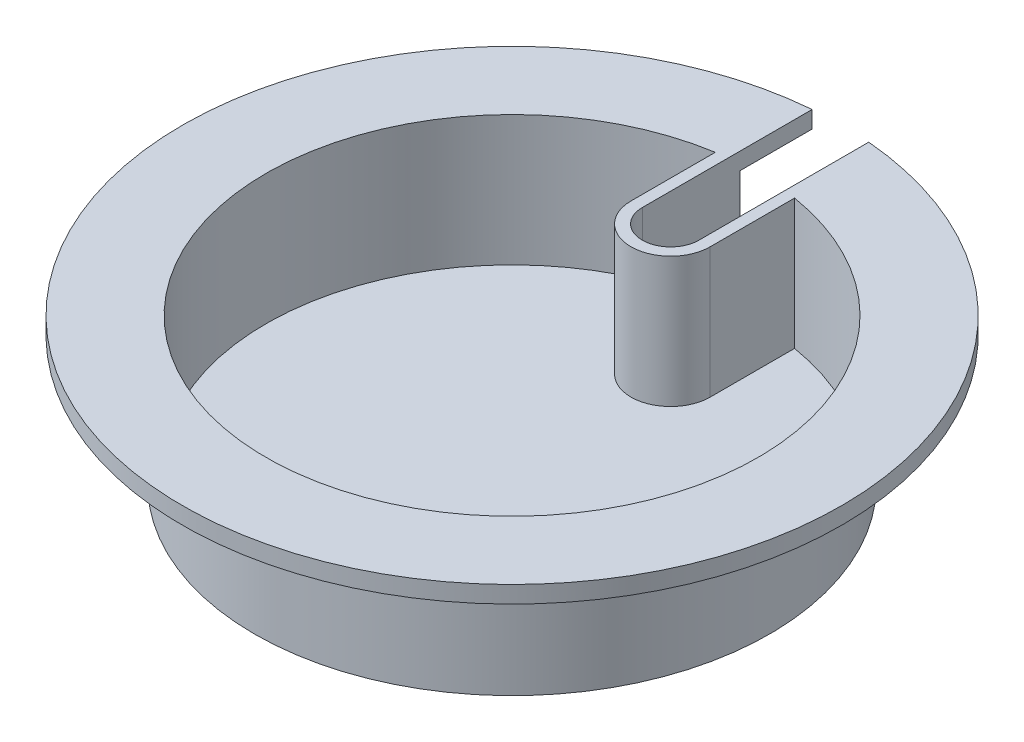
ISO-10303-21;
HEADER;
FILE_DESCRIPTION(('STEP AP214'),'2;1');
FILE_NAME('part.step','',(''),(''),'','','');
FILE_SCHEMA(('AUTOMOTIVE_DESIGN { 1 0 10303 214 1 1 1 1 }'));
ENDSEC;
DATA;
#1=APPLICATION_CONTEXT('core data for automotive mechanical design processes');
#2=APPLICATION_PROTOCOL_DEFINITION('international standard','automotive_design',2000,#1);
#3=PRODUCT_CONTEXT('',#1,'mechanical');
#4=PRODUCT('Part','Part','',(#3));
#5=PRODUCT_RELATED_PRODUCT_CATEGORY('part','',(#4));
#6=PRODUCT_DEFINITION_FORMATION('','',#4);
#7=PRODUCT_DEFINITION_CONTEXT('part definition',#1,'design');
#8=PRODUCT_DEFINITION('design','',#6,#7);
#9=PRODUCT_DEFINITION_SHAPE('','',#8);
#10=(LENGTH_UNIT() NAMED_UNIT(*) SI_UNIT(.MILLI.,.METRE.));
#11=(NAMED_UNIT(*) PLANE_ANGLE_UNIT() SI_UNIT($,.RADIAN.));
#12=(NAMED_UNIT(*) SI_UNIT($,.STERADIAN.) SOLID_ANGLE_UNIT());
#13=UNCERTAINTY_MEASURE_WITH_UNIT(LENGTH_MEASURE(1.E-05),#10,'distance_accuracy_value','');
#14=(GEOMETRIC_REPRESENTATION_CONTEXT(3) GLOBAL_UNCERTAINTY_ASSIGNED_CONTEXT((#13)) GLOBAL_UNIT_ASSIGNED_CONTEXT((#10,
#11,#12)) REPRESENTATION_CONTEXT('',''));
#15=CARTESIAN_POINT('',(0.,0.,0.));
#16=DIRECTION('',(0.,0.,1.));
#17=DIRECTION('',(1.,0.,0.));
#18=AXIS2_PLACEMENT_3D('',#15,#16,#17);
#19=CARTESIAN_POINT('',(0.,10.,0.));
#20=DIRECTION('',(0.,-1.,0.));
#21=DIRECTION('',(0.,0.,-1.));
#22=AXIS2_PLACEMENT_3D('',#19,#20,#21);
#23=CYLINDRICAL_SURFACE('',#22,21.7301757817244);
#24=CARTESIAN_POINT('',(0.,0.,0.));
#25=DIRECTION('',(0.,1.,0.));
#26=DIRECTION('',(0.,0.,1.));
#27=AXIS2_PLACEMENT_3D('',#24,#25,#26);
#28=CIRCLE('',#27,21.7301757817244);
#29=CARTESIAN_POINT('',(-3.5,0.,-21.4464575047872));
#30=VERTEX_POINT('',#29);
#31=CARTESIAN_POINT('',(3.5,0.,-21.4464575047872));
#32=VERTEX_POINT('',#31);
#33=EDGE_CURVE('E49',#30,#32,#28,.T.);
#34=ORIENTED_EDGE('',*,*,#33,.F.);
#35=DIRECTION('',(0.,-1.,0.));
#36=VECTOR('',#35,1.);
#37=CARTESIAN_POINT('',(-3.5,10.,-21.4464575047872));
#38=LINE('',#37,#36);
#39=CARTESIAN_POINT('',(-3.5,11.5,-21.4464575047872));
#40=VERTEX_POINT('',#39);
#41=EDGE_CURVE('E108',#40,#30,#38,.T.);
#42=ORIENTED_EDGE('',*,*,#41,.F.);
#43=CARTESIAN_POINT('',(0.,11.5,0.));
#44=DIRECTION('',(0.,1.,0.));
#45=DIRECTION('',(0.,0.,1.));
#46=AXIS2_PLACEMENT_3D('',#43,#44,#45);
#47=CIRCLE('',#46,21.7301757817244);
#48=CARTESIAN_POINT('',(3.5,11.5,-21.4464575047872));
#49=VERTEX_POINT('',#48);
#50=EDGE_CURVE('E111',#40,#49,#47,.T.);
#51=ORIENTED_EDGE('',*,*,#50,.T.);
#52=DIRECTION('',(0.,-1.,0.));
#53=VECTOR('',#52,1.);
#54=CARTESIAN_POINT('',(3.5,10.,-21.4464575047872));
#55=LINE('',#54,#53);
#56=EDGE_CURVE('E177',#49,#32,#55,.T.);
#57=ORIENTED_EDGE('',*,*,#56,.T.);
#58=EDGE_LOOP('',(#34,#42,#51,#57));
#59=FACE_BOUND('',#58,.T.);
#60=ADVANCED_FACE('F33',(#59),#23,.F.);
#61=CARTESIAN_POINT('',(3.5,10.,-14.));
#62=DIRECTION('',(1.,0.,0.));
#63=DIRECTION('',(0.,0.,-1.));
#64=AXIS2_PLACEMENT_3D('',#61,#62,#63);
#65=PLANE('',#64);
#66=DIRECTION('',(0.,0.,1.));
#67=VECTOR('',#66,1.);
#68=CARTESIAN_POINT('',(3.5,0.,-14.));
#69=LINE('',#68,#67);
#70=CARTESIAN_POINT('',(3.5,0.,-14.));
#71=VERTEX_POINT('',#70);
#72=EDGE_CURVE('E53',#32,#71,#69,.T.);
#73=ORIENTED_EDGE('',*,*,#72,.F.);
#74=ORIENTED_EDGE('',*,*,#56,.F.);
#75=DIRECTION('',(0.,0.,-1.));
#76=VECTOR('',#75,1.);
#77=CARTESIAN_POINT('',(3.5,11.5,0.));
#78=LINE('',#77,#76);
#79=CARTESIAN_POINT('',(3.5,11.5,-14.));
#80=VERTEX_POINT('',#79);
#81=EDGE_CURVE('E126',#80,#49,#78,.T.);
#82=ORIENTED_EDGE('',*,*,#81,.F.);
#83=DIRECTION('',(0.,-1.,0.));
#84=VECTOR('',#83,1.);
#85=CARTESIAN_POINT('',(3.5,10.,-14.));
#86=LINE('',#85,#84);
#87=EDGE_CURVE('E175',#80,#71,#86,.T.);
#88=ORIENTED_EDGE('',*,*,#87,.T.);
#89=EDGE_LOOP('',(#73,#74,#82,#88));
#90=FACE_BOUND('',#89,.T.);
#91=ADVANCED_FACE('F229',(#90),#65,.T.);
#92=CARTESIAN_POINT('',(0.,10.,-14.));
#93=DIRECTION('',(0.,-1.,0.));
#94=DIRECTION('',(0.,0.,-1.));
#95=AXIS2_PLACEMENT_3D('',#92,#93,#94);
#96=CYLINDRICAL_SURFACE('',#95,3.5);
#97=CARTESIAN_POINT('',(0.,0.,-14.));
#98=DIRECTION('',(0.,-1.,0.));
#99=DIRECTION('',(0.,0.,1.));
#100=AXIS2_PLACEMENT_3D('',#97,#98,#99);
#101=CIRCLE('',#100,3.5);
#102=CARTESIAN_POINT('',(-3.5,0.,-14.));
#103=VERTEX_POINT('',#102);
#104=EDGE_CURVE('E170',#71,#103,#101,.T.);
#105=ORIENTED_EDGE('',*,*,#104,.F.);
#106=ORIENTED_EDGE('',*,*,#87,.F.);
#107=CARTESIAN_POINT('',(0.,11.5,-14.));
#108=DIRECTION('',(0.,1.,0.));
#109=DIRECTION('',(0.,0.,1.));
#110=AXIS2_PLACEMENT_3D('',#107,#108,#109);
#111=CIRCLE('',#110,3.5);
#112=CARTESIAN_POINT('',(-3.5,11.5,-14.));
#113=VERTEX_POINT('',#112);
#114=EDGE_CURVE('E132',#113,#80,#111,.T.);
#115=ORIENTED_EDGE('',*,*,#114,.F.);
#116=DIRECTION('',(0.,-1.,0.));
#117=VECTOR('',#116,1.);
#118=CARTESIAN_POINT('',(-3.5,10.,-14.));
#119=LINE('',#118,#117);
#120=EDGE_CURVE('E115',#113,#103,#119,.T.);
#121=ORIENTED_EDGE('',*,*,#120,.T.);
#122=EDGE_LOOP('',(#105,#106,#115,#121));
#123=FACE_BOUND('',#122,.T.);
#124=ADVANCED_FACE('F233',(#123),#96,.T.);
#125=CARTESIAN_POINT('',(-3.5,10.,-21.4464575047872));
#126=DIRECTION('',(-1.,0.,0.));
#127=DIRECTION('',(0.,0.,1.));
#128=AXIS2_PLACEMENT_3D('',#125,#126,#127);
#129=PLANE('',#128);
#130=DIRECTION('',(0.,0.,-1.));
#131=VECTOR('',#130,1.);
#132=CARTESIAN_POINT('',(-3.5,0.,-21.4464575047872));
#133=LINE('',#132,#131);
#134=EDGE_CURVE('E116',#103,#30,#133,.T.);
#135=ORIENTED_EDGE('',*,*,#134,.F.);
#136=ORIENTED_EDGE('',*,*,#120,.F.);
#137=DIRECTION('',(0.,0.,-1.));
#138=VECTOR('',#137,1.);
#139=CARTESIAN_POINT('',(-3.5,11.5,0.));
#140=LINE('',#139,#138);
#141=EDGE_CURVE('E124',#113,#40,#140,.T.);
#142=ORIENTED_EDGE('',*,*,#141,.T.);
#143=ORIENTED_EDGE('',*,*,#41,.T.);
#144=EDGE_LOOP('',(#135,#136,#142,#143));
#145=FACE_BOUND('',#144,.T.);
#146=ADVANCED_FACE('F129',(#145),#129,.T.);
#147=CARTESIAN_POINT('',(0.,0.,0.));
#148=DIRECTION('',(0.,1.,0.));
#149=DIRECTION('',(0.,0.,1.));
#150=AXIS2_PLACEMENT_3D('',#147,#148,#149);
#151=PLANE('',#150);
#152=ORIENTED_EDGE('',*,*,#33,.T.);
#153=ORIENTED_EDGE('',*,*,#72,.T.);
#154=ORIENTED_EDGE('',*,*,#104,.T.);
#155=ORIENTED_EDGE('',*,*,#134,.T.);
#156=EDGE_LOOP('',(#152,#153,#154,#155));
#157=FACE_BOUND('',#156,.T.);
#158=ADVANCED_FACE('F242',(#157),#151,.T.);
#159=CARTESIAN_POINT('',(0.,10.,0.));
#160=DIRECTION('',(0.,1.,0.));
#161=DIRECTION('',(0.,0.,1.));
#162=AXIS2_PLACEMENT_3D('',#159,#160,#161);
#163=PLANE('',#162);
#164=DIRECTION('',(0.,0.,-1.));
#165=VECTOR('',#164,1.);
#166=CARTESIAN_POINT('',(-2.5,10.,0.));
#167=LINE('',#166,#165);
#168=CARTESIAN_POINT('',(-2.5,10.,-22.612220147522));
#169=VERTEX_POINT('',#168);
#170=CARTESIAN_POINT('',(-2.5,10.,-29.));
#171=VERTEX_POINT('',#170);
#172=EDGE_CURVE('E154',#169,#171,#167,.T.);
#173=ORIENTED_EDGE('',*,*,#172,.F.);
#174=CARTESIAN_POINT('',(0.,10.,0.));
#175=DIRECTION('',(0.,1.,0.));
#176=DIRECTION('',(0.,0.,1.));
#177=AXIS2_PLACEMENT_3D('',#174,#175,#176);
#178=CIRCLE('',#177,22.75);
#179=CARTESIAN_POINT('',(2.5,10.,-22.612220147522));
#180=VERTEX_POINT('',#179);
#181=EDGE_CURVE('E179',#169,#180,#178,.T.);
#182=ORIENTED_EDGE('',*,*,#181,.T.);
#183=DIRECTION('',(0.,0.,-1.));
#184=VECTOR('',#183,1.);
#185=CARTESIAN_POINT('',(2.5,10.,0.));
#186=LINE('',#185,#184);
#187=CARTESIAN_POINT('',(2.5,10.,-29.));
#188=VERTEX_POINT('',#187);
#189=EDGE_CURVE('E127',#180,#188,#186,.T.);
#190=ORIENTED_EDGE('',*,*,#189,.T.);
#191=CARTESIAN_POINT('',(0.,10.,0.));
#192=DIRECTION('',(0.,1.,0.));
#193=DIRECTION('',(0.,0.,1.));
#194=AXIS2_PLACEMENT_3D('',#191,#192,#193);
#195=CIRCLE('',#194,29.1075591556558);
#196=EDGE_CURVE('E151',#171,#188,#195,.T.);
#197=ORIENTED_EDGE('',*,*,#196,.F.);
#198=EDGE_LOOP('',(#173,#182,#190,#197));
#199=FACE_BOUND('',#198,.T.);
#200=ADVANCED_FACE('F245',(#199),#163,.F.);
#201=CARTESIAN_POINT('',(0.,11.5,0.));
#202=DIRECTION('',(0.,-1.,0.));
#203=DIRECTION('',(0.,0.,-1.));
#204=AXIS2_PLACEMENT_3D('',#201,#202,#203);
#205=CYLINDRICAL_SURFACE('',#204,29.1075591556558);
#206=ORIENTED_EDGE('',*,*,#196,.T.);
#207=DIRECTION('',(0.,-1.,0.));
#208=VECTOR('',#207,1.);
#209=CARTESIAN_POINT('',(2.5,11.5,-29.));
#210=LINE('',#209,#208);
#211=CARTESIAN_POINT('',(2.5,11.5,-29.));
#212=VERTEX_POINT('',#211);
#213=EDGE_CURVE('E148',#212,#188,#210,.T.);
#214=ORIENTED_EDGE('',*,*,#213,.F.);
#215=CARTESIAN_POINT('',(0.,11.5,0.));
#216=DIRECTION('',(0.,1.,0.));
#217=DIRECTION('',(0.,0.,1.));
#218=AXIS2_PLACEMENT_3D('',#215,#216,#217);
#219=CIRCLE('',#218,29.1075591556558);
#220=CARTESIAN_POINT('',(-2.5,11.5,-29.));
#221=VERTEX_POINT('',#220);
#222=EDGE_CURVE('E140',#221,#212,#219,.T.);
#223=ORIENTED_EDGE('',*,*,#222,.F.);
#224=DIRECTION('',(0.,-1.,0.));
#225=VECTOR('',#224,1.);
#226=CARTESIAN_POINT('',(-2.5,11.5,-29.));
#227=LINE('',#226,#225);
#228=EDGE_CURVE('E157',#221,#171,#227,.T.);
#229=ORIENTED_EDGE('',*,*,#228,.T.);
#230=EDGE_LOOP('',(#206,#214,#223,#229));
#231=FACE_BOUND('',#230,.T.);
#232=ADVANCED_FACE('F224',(#231),#205,.T.);
#233=CARTESIAN_POINT('',(0.,11.5,0.));
#234=DIRECTION('',(0.,1.,0.));
#235=DIRECTION('',(0.,0.,1.));
#236=AXIS2_PLACEMENT_3D('',#233,#234,#235);
#237=PLANE('',#236);
#238=ORIENTED_EDGE('',*,*,#50,.F.);
#239=ORIENTED_EDGE('',*,*,#141,.F.);
#240=ORIENTED_EDGE('',*,*,#114,.T.);
#241=ORIENTED_EDGE('',*,*,#81,.T.);
#242=EDGE_LOOP('',(#238,#239,#240,#241));
#243=FACE_BOUND('',#242,.T.);
#244=DIRECTION('',(0.,0.,-1.));
#245=VECTOR('',#244,1.);
#246=CARTESIAN_POINT('',(-2.5,11.5,0.));
#247=LINE('',#246,#245);
#248=CARTESIAN_POINT('',(-2.5,11.5,-14.));
#249=VERTEX_POINT('',#248);
#250=EDGE_CURVE('E137',#249,#221,#247,.T.);
#251=ORIENTED_EDGE('',*,*,#250,.T.);
#252=ORIENTED_EDGE('',*,*,#222,.T.);
#253=DIRECTION('',(0.,0.,-1.));
#254=VECTOR('',#253,1.);
#255=CARTESIAN_POINT('',(2.5,11.5,0.));
#256=LINE('',#255,#254);
#257=CARTESIAN_POINT('',(2.5,11.5,-14.));
#258=VERTEX_POINT('',#257);
#259=EDGE_CURVE('E142',#258,#212,#256,.T.);
#260=ORIENTED_EDGE('',*,*,#259,.F.);
#261=CARTESIAN_POINT('',(0.,11.5,-14.));
#262=DIRECTION('',(0.,1.,0.));
#263=DIRECTION('',(0.,0.,1.));
#264=AXIS2_PLACEMENT_3D('',#261,#262,#263);
#265=CIRCLE('',#264,2.5);
#266=EDGE_CURVE('E145',#249,#258,#265,.T.);
#267=ORIENTED_EDGE('',*,*,#266,.F.);
#268=EDGE_LOOP('',(#251,#252,#260,#267));
#269=FACE_BOUND('',#268,.T.);
#270=ADVANCED_FACE('F121',(#243,#269),#237,.T.);
#271=CARTESIAN_POINT('',(0.,-1.5,0.));
#272=DIRECTION('',(0.,1.,0.));
#273=DIRECTION('',(0.,0.,1.));
#274=AXIS2_PLACEMENT_3D('',#271,#272,#273);
#275=PLANE('',#274);
#276=CARTESIAN_POINT('',(0.,-1.5,0.));
#277=DIRECTION('',(0.,1.,0.));
#278=DIRECTION('',(0.,0.,1.));
#279=AXIS2_PLACEMENT_3D('',#276,#277,#278);
#280=CIRCLE('',#279,22.75);
#281=CARTESIAN_POINT('',(-2.5,-1.5,-22.612220147522));
#282=VERTEX_POINT('',#281);
#283=CARTESIAN_POINT('',(2.5,-1.5,-22.612220147522));
#284=VERTEX_POINT('',#283);
#285=EDGE_CURVE('E182',#282,#284,#280,.T.);
#286=ORIENTED_EDGE('',*,*,#285,.F.);
#287=DIRECTION('',(0.,0.,-1.));
#288=VECTOR('',#287,1.);
#289=CARTESIAN_POINT('',(-2.5,-1.5,0.));
#290=LINE('',#289,#288);
#291=CARTESIAN_POINT('',(-2.5,-1.5,-14.));
#292=VERTEX_POINT('',#291);
#293=EDGE_CURVE('E192',#292,#282,#290,.T.);
#294=ORIENTED_EDGE('',*,*,#293,.F.);
#295=CARTESIAN_POINT('',(0.,-1.5,-14.));
#296=DIRECTION('',(0.,1.,0.));
#297=DIRECTION('',(0.,0.,1.));
#298=AXIS2_PLACEMENT_3D('',#295,#296,#297);
#299=CIRCLE('',#298,2.5);
#300=CARTESIAN_POINT('',(2.5,-1.5,-14.));
#301=VERTEX_POINT('',#300);
#302=EDGE_CURVE('E199',#292,#301,#299,.T.);
#303=ORIENTED_EDGE('',*,*,#302,.T.);
#304=DIRECTION('',(0.,0.,-1.));
#305=VECTOR('',#304,1.);
#306=CARTESIAN_POINT('',(2.5,-1.5,0.));
#307=LINE('',#306,#305);
#308=EDGE_CURVE('E203',#301,#284,#307,.T.);
#309=ORIENTED_EDGE('',*,*,#308,.T.);
#310=EDGE_LOOP('',(#286,#294,#303,#309));
#311=FACE_BOUND('',#310,.T.);
#312=ADVANCED_FACE('F217',(#311),#275,.F.);
#313=CARTESIAN_POINT('',(0.,-1.5,0.));
#314=DIRECTION('',(0.,1.,0.));
#315=DIRECTION('',(0.,0.,1.));
#316=AXIS2_PLACEMENT_3D('',#313,#314,#315);
#317=CYLINDRICAL_SURFACE('',#316,22.75);
#318=DIRECTION('',(0.,1.,0.));
#319=VECTOR('',#318,1.);
#320=CARTESIAN_POINT('',(2.5,-1.5,-22.612220147522));
#321=LINE('',#320,#319);
#322=EDGE_CURVE('E190',#284,#180,#321,.T.);
#323=ORIENTED_EDGE('',*,*,#322,.T.);
#324=ORIENTED_EDGE('',*,*,#181,.F.);
#325=DIRECTION('',(0.,1.,0.));
#326=VECTOR('',#325,1.);
#327=CARTESIAN_POINT('',(-2.5,-1.5,-22.612220147522));
#328=LINE('',#327,#326);
#329=EDGE_CURVE('E11',#282,#169,#328,.T.);
#330=ORIENTED_EDGE('',*,*,#329,.F.);
#331=ORIENTED_EDGE('',*,*,#285,.T.);
#332=EDGE_LOOP('',(#323,#324,#330,#331));
#333=FACE_BOUND('',#332,.T.);
#334=ADVANCED_FACE('F35',(#333),#317,.T.);
#335=CARTESIAN_POINT('',(-2.5,-1.5,0.));
#336=DIRECTION('',(1.,0.,0.));
#337=DIRECTION('',(0.,0.,-1.));
#338=AXIS2_PLACEMENT_3D('',#335,#336,#337);
#339=PLANE('',#338);
#340=ORIENTED_EDGE('',*,*,#329,.T.);
#341=ORIENTED_EDGE('',*,*,#172,.T.);
#342=ORIENTED_EDGE('',*,*,#228,.F.);
#343=ORIENTED_EDGE('',*,*,#250,.F.);
#344=DIRECTION('',(0.,1.,0.));
#345=VECTOR('',#344,1.);
#346=CARTESIAN_POINT('',(-2.5,-1.5,-14.));
#347=LINE('',#346,#345);
#348=EDGE_CURVE('E42',#292,#249,#347,.T.);
#349=ORIENTED_EDGE('',*,*,#348,.F.);
#350=ORIENTED_EDGE('',*,*,#293,.T.);
#351=EDGE_LOOP('',(#340,#341,#342,#343,#349,#350));
#352=FACE_BOUND('',#351,.T.);
#353=ADVANCED_FACE('F211',(#352),#339,.T.);
#354=CARTESIAN_POINT('',(0.,-1.5,-14.));
#355=DIRECTION('',(0.,1.,0.));
#356=DIRECTION('',(0.,0.,1.));
#357=AXIS2_PLACEMENT_3D('',#354,#355,#356);
#358=CYLINDRICAL_SURFACE('',#357,2.5);
#359=ORIENTED_EDGE('',*,*,#348,.T.);
#360=ORIENTED_EDGE('',*,*,#266,.T.);
#361=DIRECTION('',(0.,1.,0.));
#362=VECTOR('',#361,1.);
#363=CARTESIAN_POINT('',(2.5,-1.5,-14.));
#364=LINE('',#363,#362);
#365=EDGE_CURVE('E188',#301,#258,#364,.T.);
#366=ORIENTED_EDGE('',*,*,#365,.F.);
#367=ORIENTED_EDGE('',*,*,#302,.F.);
#368=EDGE_LOOP('',(#359,#360,#366,#367));
#369=FACE_BOUND('',#368,.T.);
#370=ADVANCED_FACE('F208',(#369),#358,.F.);
#371=CARTESIAN_POINT('',(2.5,-1.5,0.));
#372=DIRECTION('',(1.,0.,0.));
#373=DIRECTION('',(0.,0.,-1.));
#374=AXIS2_PLACEMENT_3D('',#371,#372,#373);
#375=PLANE('',#374);
#376=ORIENTED_EDGE('',*,*,#365,.T.);
#377=ORIENTED_EDGE('',*,*,#259,.T.);
#378=ORIENTED_EDGE('',*,*,#213,.T.);
#379=ORIENTED_EDGE('',*,*,#189,.F.);
#380=ORIENTED_EDGE('',*,*,#322,.F.);
#381=ORIENTED_EDGE('',*,*,#308,.F.);
#382=EDGE_LOOP('',(#376,#377,#378,#379,#380,#381));
#383=FACE_BOUND('',#382,.T.);
#384=ADVANCED_FACE('F213',(#383),#375,.F.);
#385=CLOSED_SHELL('',(#60,#91,#124,#146,#158,#200,#232,#270,#312,#334,#353,#370,#384));
#386=MANIFOLD_SOLID_BREP('B2',#385);
#387=ADVANCED_BREP_SHAPE_REPRESENTATION('',(#18,#386),#14);
#388=SHAPE_DEFINITION_REPRESENTATION(#9,#387);
ENDSEC;
END-ISO-10303-21;
